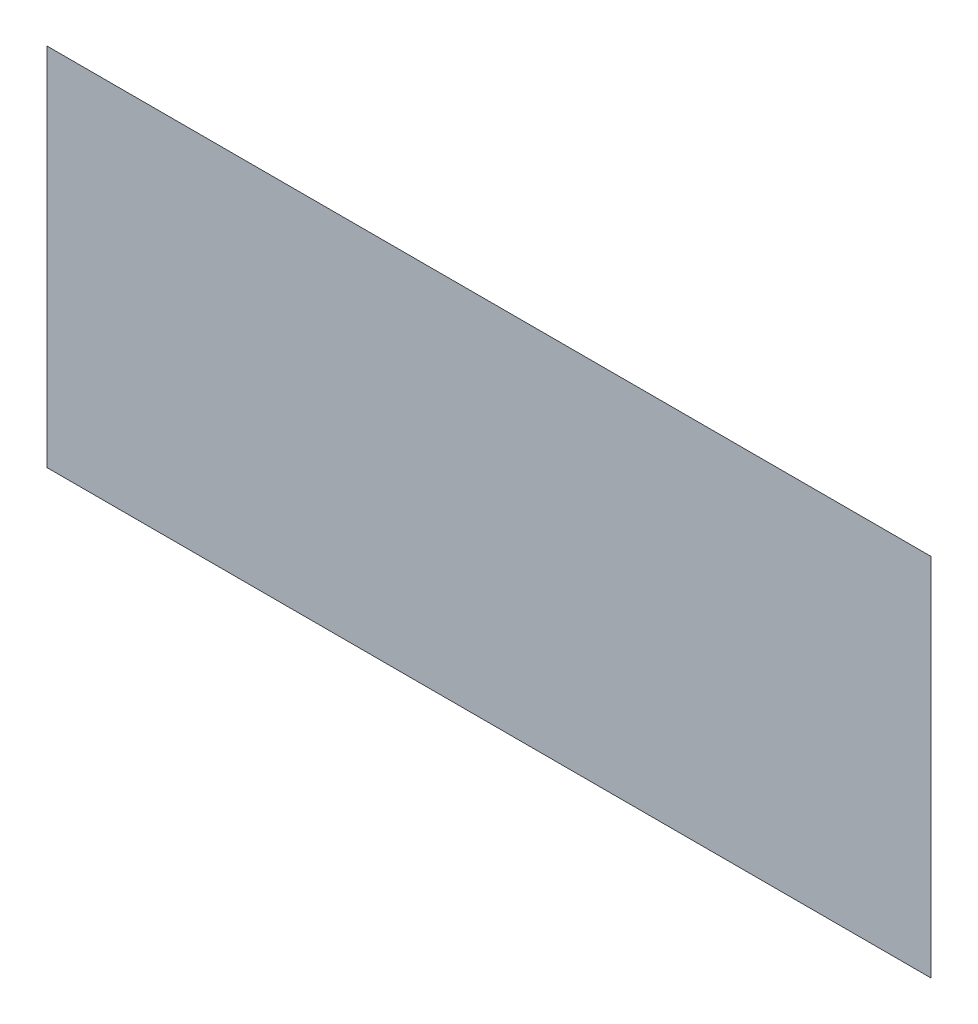
ISO-10303-21;
HEADER;
FILE_DESCRIPTION(('STEP AP214'),'2;1');
FILE_NAME('part.step','',(''),(''),'','','');
FILE_SCHEMA(('AUTOMOTIVE_DESIGN { 1 0 10303 214 1 1 1 1 }'));
ENDSEC;
DATA;
#1=APPLICATION_CONTEXT('core data for automotive mechanical design processes');
#2=APPLICATION_PROTOCOL_DEFINITION('international standard','automotive_design',2000,#1);
#3=PRODUCT_CONTEXT('',#1,'mechanical');
#4=PRODUCT('Part','Part','',(#3));
#5=PRODUCT_RELATED_PRODUCT_CATEGORY('part','',(#4));
#6=PRODUCT_DEFINITION_FORMATION('','',#4);
#7=PRODUCT_DEFINITION_CONTEXT('part definition',#1,'design');
#8=PRODUCT_DEFINITION('design','',#6,#7);
#9=PRODUCT_DEFINITION_SHAPE('','',#8);
#10=(LENGTH_UNIT() NAMED_UNIT(*) SI_UNIT(.MILLI.,.METRE.));
#11=(NAMED_UNIT(*) PLANE_ANGLE_UNIT() SI_UNIT($,.RADIAN.));
#12=(NAMED_UNIT(*) SI_UNIT($,.STERADIAN.) SOLID_ANGLE_UNIT());
#13=UNCERTAINTY_MEASURE_WITH_UNIT(LENGTH_MEASURE(1.E-05),#10,'distance_accuracy_value','');
#14=(GEOMETRIC_REPRESENTATION_CONTEXT(3) GLOBAL_UNCERTAINTY_ASSIGNED_CONTEXT((#13)) GLOBAL_UNIT_ASSIGNED_CONTEXT((#10,
#11,#12)) REPRESENTATION_CONTEXT('',''));
#15=CARTESIAN_POINT('',(0.,0.,0.));
#16=DIRECTION('',(0.,0.,1.));
#17=DIRECTION('',(1.,0.,0.));
#18=AXIS2_PLACEMENT_3D('',#15,#16,#17);
#19=CARTESIAN_POINT('',(2.767399902344,30.186999511719,1.1596000001));
#20=DIRECTION('',(0.,0.,1.));
#21=DIRECTION('',(1.,0.,0.));
#22=AXIS2_PLACEMENT_3D('',#19,#20,#21);
#23=PLANE('',#22);
#24=CARTESIAN_POINT('',(1.617399902344,29.711999511719,1.1596000001));
#25=DIRECTION('',(1.,0.,0.));
#26=VECTOR('',#25,1.);
#27=LINE('',#24,#26);
#28=CARTESIAN_POINT('',(1.617399902344,29.711999511719,1.1595500001));
#29=VERTEX_POINT('',#28);
#30=CARTESIAN_POINT('',(3.917399902344,29.711999511719,1.1595500001));
#31=VERTEX_POINT('',#30);
#32=EDGE_CURVE('E54',#29,#31,#27,.T.);
#33=ORIENTED_EDGE('',*,*,#32,.T.);
#34=CARTESIAN_POINT('',(3.917399902344,29.711999511719,1.1596000001));
#35=DIRECTION('',(0.,1.,0.));
#36=VECTOR('',#35,1.);
#37=LINE('',#34,#36);
#38=CARTESIAN_POINT('',(3.917399902344,30.661999511719,1.1595500001));
#39=VERTEX_POINT('',#38);
#40=EDGE_CURVE('E56',#31,#39,#37,.T.);
#41=ORIENTED_EDGE('',*,*,#40,.T.);
#42=CARTESIAN_POINT('',(3.917399902344,30.661999511719,1.1596000001));
#43=DIRECTION('',(-1.,0.,0.));
#44=VECTOR('',#43,1.);
#45=LINE('',#42,#44);
#46=CARTESIAN_POINT('',(1.617399902344,30.661999511719,1.1595500001));
#47=VERTEX_POINT('',#46);
#48=EDGE_CURVE('E11',#39,#47,#45,.T.);
#49=ORIENTED_EDGE('',*,*,#48,.T.);
#50=CARTESIAN_POINT('',(1.617399902344,30.661999511719,1.1596000001));
#51=DIRECTION('',(0.,-1.,0.));
#52=VECTOR('',#51,1.);
#53=LINE('',#50,#52);
#54=EDGE_CURVE('E29',#47,#29,#53,.T.);
#55=ORIENTED_EDGE('',*,*,#54,.T.);
#56=EDGE_LOOP('',(#33,#41,#49,#55));
#57=FACE_BOUND('',#56,.T.);
#58=ADVANCED_FACE('F17',(#57),#23,.T.);
#59=CARTESIAN_POINT('',(2.767399902344,30.186999511719,1.1595000001));
#60=DIRECTION('',(0.,0.,1.));
#61=DIRECTION('',(1.,0.,0.));
#62=AXIS2_PLACEMENT_3D('',#59,#60,#61);
#63=PLANE('',#62);
#64=ORIENTED_EDGE('',*,*,#40,.F.);
#65=ORIENTED_EDGE('',*,*,#32,.F.);
#66=ORIENTED_EDGE('',*,*,#54,.F.);
#67=ORIENTED_EDGE('',*,*,#48,.F.);
#68=EDGE_LOOP('',(#64,#65,#66,#67));
#69=FACE_BOUND('',#68,.T.);
#70=ADVANCED_FACE('F63',(#69),#63,.F.);
#71=CLOSED_SHELL('',(#58,#70));
#72=MANIFOLD_SOLID_BREP('B1',#71);
#73=ADVANCED_BREP_SHAPE_REPRESENTATION('',(#18,#72),#14);
#74=SHAPE_DEFINITION_REPRESENTATION(#9,#73);
ENDSEC;
END-ISO-10303-21;
